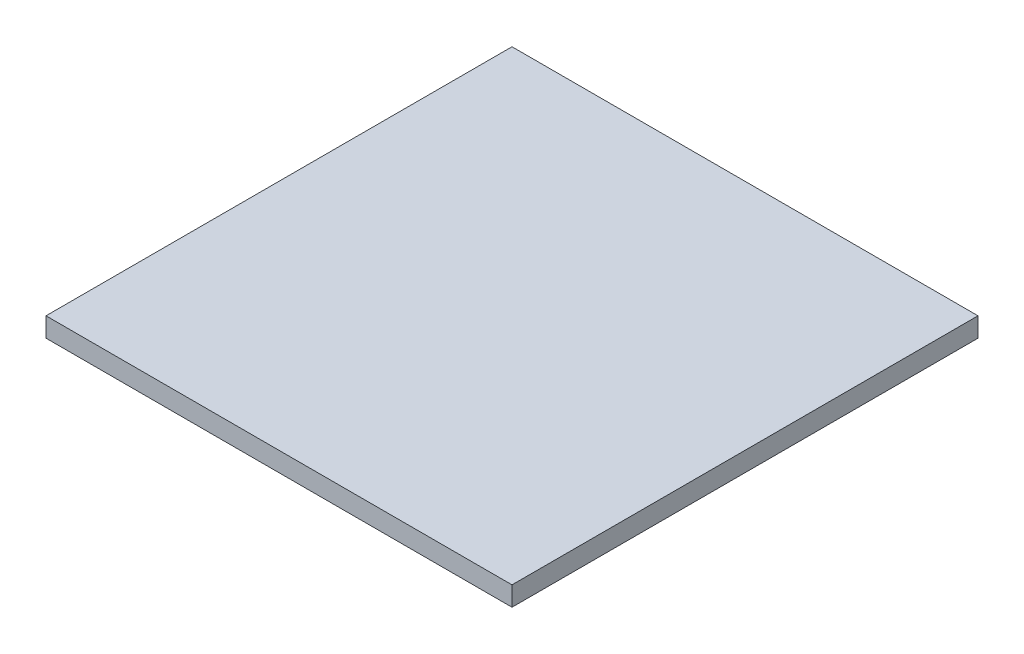
ISO-10303-21;
HEADER;
FILE_DESCRIPTION(('STEP AP214'),'2;1');
FILE_NAME('part.step','',(''),(''),'','','');
FILE_SCHEMA(('AUTOMOTIVE_DESIGN { 1 0 10303 214 1 1 1 1 }'));
ENDSEC;
DATA;
#1=APPLICATION_CONTEXT('core data for automotive mechanical design processes');
#2=APPLICATION_PROTOCOL_DEFINITION('international standard','automotive_design',2000,#1);
#3=PRODUCT_CONTEXT('',#1,'mechanical');
#4=PRODUCT('Part','Part','',(#3));
#5=PRODUCT_RELATED_PRODUCT_CATEGORY('part','',(#4));
#6=PRODUCT_DEFINITION_FORMATION('','',#4);
#7=PRODUCT_DEFINITION_CONTEXT('part definition',#1,'design');
#8=PRODUCT_DEFINITION('design','',#6,#7);
#9=PRODUCT_DEFINITION_SHAPE('','',#8);
#10=(LENGTH_UNIT() NAMED_UNIT(*) SI_UNIT(.MILLI.,.METRE.));
#11=(NAMED_UNIT(*) PLANE_ANGLE_UNIT() SI_UNIT($,.RADIAN.));
#12=(NAMED_UNIT(*) SI_UNIT($,.STERADIAN.) SOLID_ANGLE_UNIT());
#13=UNCERTAINTY_MEASURE_WITH_UNIT(LENGTH_MEASURE(1.E-05),#10,'distance_accuracy_value','');
#14=(GEOMETRIC_REPRESENTATION_CONTEXT(3) GLOBAL_UNCERTAINTY_ASSIGNED_CONTEXT((#13)) GLOBAL_UNIT_ASSIGNED_CONTEXT((#10,
#11,#12)) REPRESENTATION_CONTEXT('',''));
#15=CARTESIAN_POINT('',(0.,0.,0.));
#16=DIRECTION('',(0.,0.,1.));
#17=DIRECTION('',(1.,0.,0.));
#18=AXIS2_PLACEMENT_3D('',#15,#16,#17);
#19=CARTESIAN_POINT('',(-76.2,6.35,-76.2));
#20=DIRECTION('',(1.,0.,0.));
#21=DIRECTION('',(0.,0.,-1.));
#22=AXIS2_PLACEMENT_3D('',#19,#20,#21);
#23=PLANE('',#22);
#24=DIRECTION('',(0.,0.,1.));
#25=VECTOR('',#24,1.);
#26=CARTESIAN_POINT('',(-76.2,0.,-76.2));
#27=LINE('',#26,#25);
#28=CARTESIAN_POINT('',(-76.2,0.,-76.2));
#29=VERTEX_POINT('',#28);
#30=CARTESIAN_POINT('',(-76.2,0.,76.2));
#31=VERTEX_POINT('',#30);
#32=EDGE_CURVE('E97',#29,#31,#27,.T.);
#33=ORIENTED_EDGE('',*,*,#32,.T.);
#34=DIRECTION('',(0.,-1.,0.));
#35=VECTOR('',#34,1.);
#36=CARTESIAN_POINT('',(-76.2,6.35,76.2));
#37=LINE('',#36,#35);
#38=CARTESIAN_POINT('',(-76.2,6.35,76.2));
#39=VERTEX_POINT('',#38);
#40=EDGE_CURVE('E11',#39,#31,#37,.T.);
#41=ORIENTED_EDGE('',*,*,#40,.F.);
#42=DIRECTION('',(0.,0.,1.));
#43=VECTOR('',#42,1.);
#44=CARTESIAN_POINT('',(-76.2,6.35,-76.2));
#45=LINE('',#44,#43);
#46=CARTESIAN_POINT('',(-76.2,6.35,-76.2));
#47=VERTEX_POINT('',#46);
#48=EDGE_CURVE('E85',#47,#39,#45,.T.);
#49=ORIENTED_EDGE('',*,*,#48,.F.);
#50=DIRECTION('',(0.,-1.,0.));
#51=VECTOR('',#50,1.);
#52=CARTESIAN_POINT('',(-76.2,6.35,-76.2));
#53=LINE('',#52,#51);
#54=EDGE_CURVE('E93',#47,#29,#53,.T.);
#55=ORIENTED_EDGE('',*,*,#54,.T.);
#56=EDGE_LOOP('',(#33,#41,#49,#55));
#57=FACE_BOUND('',#56,.T.);
#58=ADVANCED_FACE('F34',(#57),#23,.F.);
#59=CARTESIAN_POINT('',(-76.2,6.35,76.2));
#60=DIRECTION('',(0.,0.,-1.));
#61=DIRECTION('',(-1.,0.,0.));
#62=AXIS2_PLACEMENT_3D('',#59,#60,#61);
#63=PLANE('',#62);
#64=DIRECTION('',(1.,0.,0.));
#65=VECTOR('',#64,1.);
#66=CARTESIAN_POINT('',(-76.2,0.,76.2));
#67=LINE('',#66,#65);
#68=CARTESIAN_POINT('',(76.2,0.,76.2));
#69=VERTEX_POINT('',#68);
#70=EDGE_CURVE('E89',#31,#69,#67,.T.);
#71=ORIENTED_EDGE('',*,*,#70,.T.);
#72=DIRECTION('',(0.,-1.,0.));
#73=VECTOR('',#72,1.);
#74=CARTESIAN_POINT('',(76.2,6.35,76.2));
#75=LINE('',#74,#73);
#76=CARTESIAN_POINT('',(76.2,6.35,76.2));
#77=VERTEX_POINT('',#76);
#78=EDGE_CURVE('E42',#77,#69,#75,.T.);
#79=ORIENTED_EDGE('',*,*,#78,.F.);
#80=DIRECTION('',(1.,0.,0.));
#81=VECTOR('',#80,1.);
#82=CARTESIAN_POINT('',(-76.2,6.35,76.2));
#83=LINE('',#82,#81);
#84=EDGE_CURVE('E80',#39,#77,#83,.T.);
#85=ORIENTED_EDGE('',*,*,#84,.F.);
#86=ORIENTED_EDGE('',*,*,#40,.T.);
#87=EDGE_LOOP('',(#71,#79,#85,#86));
#88=FACE_BOUND('',#87,.T.);
#89=ADVANCED_FACE('F88',(#88),#63,.F.);
#90=CARTESIAN_POINT('',(76.2,6.35,-76.2));
#91=DIRECTION('',(-1.,0.,0.));
#92=DIRECTION('',(0.,0.,1.));
#93=AXIS2_PLACEMENT_3D('',#90,#91,#92);
#94=PLANE('',#93);
#95=DIRECTION('',(0.,0.,-1.));
#96=VECTOR('',#95,1.);
#97=CARTESIAN_POINT('',(76.2,0.,-76.2));
#98=LINE('',#97,#96);
#99=CARTESIAN_POINT('',(76.2,0.,-76.2));
#100=VERTEX_POINT('',#99);
#101=EDGE_CURVE('E67',#69,#100,#98,.T.);
#102=ORIENTED_EDGE('',*,*,#101,.T.);
#103=DIRECTION('',(0.,-1.,0.));
#104=VECTOR('',#103,1.);
#105=CARTESIAN_POINT('',(76.2,6.35,-76.2));
#106=LINE('',#105,#104);
#107=CARTESIAN_POINT('',(76.2,6.35,-76.2));
#108=VERTEX_POINT('',#107);
#109=EDGE_CURVE('E90',#108,#100,#106,.T.);
#110=ORIENTED_EDGE('',*,*,#109,.F.);
#111=DIRECTION('',(0.,0.,-1.));
#112=VECTOR('',#111,1.);
#113=CARTESIAN_POINT('',(76.2,6.35,-76.2));
#114=LINE('',#113,#112);
#115=EDGE_CURVE('E83',#77,#108,#114,.T.);
#116=ORIENTED_EDGE('',*,*,#115,.F.);
#117=ORIENTED_EDGE('',*,*,#78,.T.);
#118=EDGE_LOOP('',(#102,#110,#116,#117));
#119=FACE_BOUND('',#118,.T.);
#120=ADVANCED_FACE('F91',(#119),#94,.F.);
#121=CARTESIAN_POINT('',(-76.2,6.35,-76.2));
#122=DIRECTION('',(0.,0.,1.));
#123=DIRECTION('',(1.,0.,0.));
#124=AXIS2_PLACEMENT_3D('',#121,#122,#123);
#125=PLANE('',#124);
#126=DIRECTION('',(-1.,0.,0.));
#127=VECTOR('',#126,1.);
#128=CARTESIAN_POINT('',(-76.2,0.,-76.2));
#129=LINE('',#128,#127);
#130=EDGE_CURVE('E73',#100,#29,#129,.T.);
#131=ORIENTED_EDGE('',*,*,#130,.T.);
#132=ORIENTED_EDGE('',*,*,#54,.F.);
#133=DIRECTION('',(-1.,0.,0.));
#134=VECTOR('',#133,1.);
#135=CARTESIAN_POINT('',(-76.2,6.35,-76.2));
#136=LINE('',#135,#134);
#137=EDGE_CURVE('E50',#108,#47,#136,.T.);
#138=ORIENTED_EDGE('',*,*,#137,.F.);
#139=ORIENTED_EDGE('',*,*,#109,.T.);
#140=EDGE_LOOP('',(#131,#132,#138,#139));
#141=FACE_BOUND('',#140,.T.);
#142=ADVANCED_FACE('F104',(#141),#125,.F.);
#143=CARTESIAN_POINT('',(0.,6.35,0.));
#144=DIRECTION('',(0.,1.,0.));
#145=DIRECTION('',(0.,0.,1.));
#146=AXIS2_PLACEMENT_3D('',#143,#144,#145);
#147=PLANE('',#146);
#148=ORIENTED_EDGE('',*,*,#48,.T.);
#149=ORIENTED_EDGE('',*,*,#84,.T.);
#150=ORIENTED_EDGE('',*,*,#115,.T.);
#151=ORIENTED_EDGE('',*,*,#137,.T.);
#152=EDGE_LOOP('',(#148,#149,#150,#151));
#153=FACE_BOUND('',#152,.T.);
#154=ADVANCED_FACE('F81',(#153),#147,.T.);
#155=CARTESIAN_POINT('',(0.,0.,0.));
#156=DIRECTION('',(0.,1.,0.));
#157=DIRECTION('',(0.,0.,1.));
#158=AXIS2_PLACEMENT_3D('',#155,#156,#157);
#159=PLANE('',#158);
#160=ORIENTED_EDGE('',*,*,#32,.F.);
#161=ORIENTED_EDGE('',*,*,#130,.F.);
#162=ORIENTED_EDGE('',*,*,#101,.F.);
#163=ORIENTED_EDGE('',*,*,#70,.F.);
#164=EDGE_LOOP('',(#160,#161,#162,#163));
#165=FACE_BOUND('',#164,.T.);
#166=ADVANCED_FACE('F107',(#165),#159,.F.);
#167=CLOSED_SHELL('',(#58,#89,#120,#142,#154,#166));
#168=MANIFOLD_SOLID_BREP('B2',#167);
#169=ADVANCED_BREP_SHAPE_REPRESENTATION('',(#18,#168),#14);
#170=SHAPE_DEFINITION_REPRESENTATION(#9,#169);
ENDSEC;
END-ISO-10303-21;
